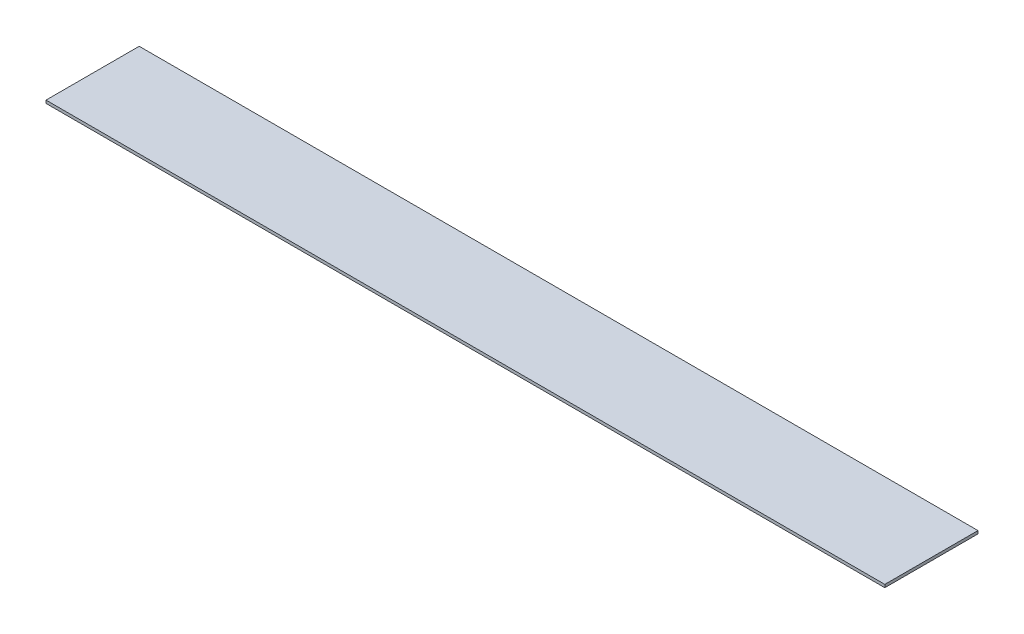
ISO-10303-21;
HEADER;
FILE_DESCRIPTION(('STEP AP214'),'2;1');
FILE_NAME('part.step','',(''),(''),'','','');
FILE_SCHEMA(('AUTOMOTIVE_DESIGN { 1 0 10303 214 1 1 1 1 }'));
ENDSEC;
DATA;
#1=APPLICATION_CONTEXT('core data for automotive mechanical design processes');
#2=APPLICATION_PROTOCOL_DEFINITION('international standard','automotive_design',2000,#1);
#3=PRODUCT_CONTEXT('',#1,'mechanical');
#4=PRODUCT('Part','Part','',(#3));
#5=PRODUCT_RELATED_PRODUCT_CATEGORY('part','',(#4));
#6=PRODUCT_DEFINITION_FORMATION('','',#4);
#7=PRODUCT_DEFINITION_CONTEXT('part definition',#1,'design');
#8=PRODUCT_DEFINITION('design','',#6,#7);
#9=PRODUCT_DEFINITION_SHAPE('','',#8);
#10=(LENGTH_UNIT() NAMED_UNIT(*) SI_UNIT(.MILLI.,.METRE.));
#11=(NAMED_UNIT(*) PLANE_ANGLE_UNIT() SI_UNIT($,.RADIAN.));
#12=(NAMED_UNIT(*) SI_UNIT($,.STERADIAN.) SOLID_ANGLE_UNIT());
#13=UNCERTAINTY_MEASURE_WITH_UNIT(LENGTH_MEASURE(1.E-05),#10,'distance_accuracy_value','');
#14=(GEOMETRIC_REPRESENTATION_CONTEXT(3) GLOBAL_UNCERTAINTY_ASSIGNED_CONTEXT((#13)) GLOBAL_UNIT_ASSIGNED_CONTEXT((#10,
#11,#12)) REPRESENTATION_CONTEXT('',''));
#15=CARTESIAN_POINT('',(0.,0.,0.));
#16=DIRECTION('',(0.,0.,1.));
#17=DIRECTION('',(1.,0.,0.));
#18=AXIS2_PLACEMENT_3D('',#15,#16,#17);
#19=CARTESIAN_POINT('',(0.,1.5875,16.1661320040576));
#20=DIRECTION('',(0.,0.,-1.));
#21=DIRECTION('',(-1.,0.,0.));
#22=AXIS2_PLACEMENT_3D('',#19,#20,#21);
#23=PLANE('',#22);
#24=DIRECTION('',(1.,0.,0.));
#25=VECTOR('',#24,1.);
#26=CARTESIAN_POINT('',(0.,0.,16.1661320040576));
#27=LINE('',#26,#25);
#28=CARTESIAN_POINT('',(-333.947872469119,0.,16.1661320040576));
#29=VERTEX_POINT('',#28);
#30=CARTESIAN_POINT('',(123.252127530881,0.,16.1661320040576));
#31=VERTEX_POINT('',#30);
#32=EDGE_CURVE('E103',#29,#31,#27,.T.);
#33=ORIENTED_EDGE('',*,*,#32,.T.);
#34=DIRECTION('',(0.,-1.,0.));
#35=VECTOR('',#34,1.);
#36=CARTESIAN_POINT('',(123.252127530881,1.5875,16.1661320040576));
#37=LINE('',#36,#35);
#38=CARTESIAN_POINT('',(123.252127530881,1.5875,16.1661320040576));
#39=VERTEX_POINT('',#38);
#40=EDGE_CURVE('E11',#39,#31,#37,.T.);
#41=ORIENTED_EDGE('',*,*,#40,.F.);
#42=DIRECTION('',(1.,0.,0.));
#43=VECTOR('',#42,1.);
#44=CARTESIAN_POINT('',(0.,1.5875,16.1661320040576));
#45=LINE('',#44,#43);
#46=CARTESIAN_POINT('',(-333.947872469119,1.5875,16.1661320040576));
#47=VERTEX_POINT('',#46);
#48=EDGE_CURVE('E89',#47,#39,#45,.T.);
#49=ORIENTED_EDGE('',*,*,#48,.F.);
#50=DIRECTION('',(0.,-1.,0.));
#51=VECTOR('',#50,1.);
#52=CARTESIAN_POINT('',(-333.947872469119,1.5875,16.1661320040576));
#53=LINE('',#52,#51);
#54=EDGE_CURVE('E56',#47,#29,#53,.T.);
#55=ORIENTED_EDGE('',*,*,#54,.T.);
#56=EDGE_LOOP('',(#33,#41,#49,#55));
#57=FACE_BOUND('',#56,.T.);
#58=ADVANCED_FACE('F40',(#57),#23,.F.);
#59=CARTESIAN_POINT('',(123.252127530881,1.5875,0.));
#60=DIRECTION('',(-1.,0.,0.));
#61=DIRECTION('',(0.,0.,1.));
#62=AXIS2_PLACEMENT_3D('',#59,#60,#61);
#63=PLANE('',#62);
#64=DIRECTION('',(0.,0.,-1.));
#65=VECTOR('',#64,1.);
#66=CARTESIAN_POINT('',(123.252127530881,0.,0.));
#67=LINE('',#66,#65);
#68=CARTESIAN_POINT('',(123.252127530881,0.,-34.6338679959424));
#69=VERTEX_POINT('',#68);
#70=EDGE_CURVE('E94',#31,#69,#67,.T.);
#71=ORIENTED_EDGE('',*,*,#70,.T.);
#72=DIRECTION('',(0.,-1.,0.));
#73=VECTOR('',#72,1.);
#74=CARTESIAN_POINT('',(123.252127530881,1.5875,-34.6338679959424));
#75=LINE('',#74,#73);
#76=CARTESIAN_POINT('',(123.252127530881,1.5875,-34.6338679959424));
#77=VERTEX_POINT('',#76);
#78=EDGE_CURVE('E48',#77,#69,#75,.T.);
#79=ORIENTED_EDGE('',*,*,#78,.F.);
#80=DIRECTION('',(0.,0.,-1.));
#81=VECTOR('',#80,1.);
#82=CARTESIAN_POINT('',(123.252127530881,1.5875,0.));
#83=LINE('',#82,#81);
#84=EDGE_CURVE('E81',#39,#77,#83,.T.);
#85=ORIENTED_EDGE('',*,*,#84,.F.);
#86=ORIENTED_EDGE('',*,*,#40,.T.);
#87=EDGE_LOOP('',(#71,#79,#85,#86));
#88=FACE_BOUND('',#87,.T.);
#89=ADVANCED_FACE('F93',(#88),#63,.F.);
#90=CARTESIAN_POINT('',(0.,1.5875,-34.6338679959424));
#91=DIRECTION('',(0.,0.,-1.));
#92=DIRECTION('',(-1.,0.,0.));
#93=AXIS2_PLACEMENT_3D('',#90,#91,#92);
#94=PLANE('',#93);
#95=DIRECTION('',(1.,0.,0.));
#96=VECTOR('',#95,1.);
#97=CARTESIAN_POINT('',(0.,0.,-34.6338679959424));
#98=LINE('',#97,#96);
#99=CARTESIAN_POINT('',(-333.947872469119,0.,-34.6338679959424));
#100=VERTEX_POINT('',#99);
#101=EDGE_CURVE('E106',#100,#69,#98,.T.);
#102=ORIENTED_EDGE('',*,*,#101,.F.);
#103=DIRECTION('',(0.,-1.,0.));
#104=VECTOR('',#103,1.);
#105=CARTESIAN_POINT('',(-333.947872469119,1.5875,-34.6338679959424));
#106=LINE('',#105,#104);
#107=CARTESIAN_POINT('',(-333.947872469119,1.5875,-34.6338679959424));
#108=VERTEX_POINT('',#107);
#109=EDGE_CURVE('E70',#108,#100,#106,.T.);
#110=ORIENTED_EDGE('',*,*,#109,.F.);
#111=DIRECTION('',(1.,0.,0.));
#112=VECTOR('',#111,1.);
#113=CARTESIAN_POINT('',(0.,1.5875,-34.6338679959424));
#114=LINE('',#113,#112);
#115=EDGE_CURVE('E88',#108,#77,#114,.T.);
#116=ORIENTED_EDGE('',*,*,#115,.T.);
#117=ORIENTED_EDGE('',*,*,#78,.T.);
#118=EDGE_LOOP('',(#102,#110,#116,#117));
#119=FACE_BOUND('',#118,.T.);
#120=ADVANCED_FACE('F97',(#119),#94,.T.);
#121=CARTESIAN_POINT('',(-333.947872469119,1.5875,0.));
#122=DIRECTION('',(-1.,0.,0.));
#123=DIRECTION('',(0.,0.,1.));
#124=AXIS2_PLACEMENT_3D('',#121,#122,#123);
#125=PLANE('',#124);
#126=DIRECTION('',(0.,0.,-1.));
#127=VECTOR('',#126,1.);
#128=CARTESIAN_POINT('',(-333.947872469119,0.,0.));
#129=LINE('',#128,#127);
#130=EDGE_CURVE('E108',#29,#100,#129,.T.);
#131=ORIENTED_EDGE('',*,*,#130,.F.);
#132=ORIENTED_EDGE('',*,*,#54,.F.);
#133=DIRECTION('',(0.,0.,-1.));
#134=VECTOR('',#133,1.);
#135=CARTESIAN_POINT('',(-333.947872469119,1.5875,0.));
#136=LINE('',#135,#134);
#137=EDGE_CURVE('E98',#47,#108,#136,.T.);
#138=ORIENTED_EDGE('',*,*,#137,.T.);
#139=ORIENTED_EDGE('',*,*,#109,.T.);
#140=EDGE_LOOP('',(#131,#132,#138,#139));
#141=FACE_BOUND('',#140,.T.);
#142=ADVANCED_FACE('F114',(#141),#125,.T.);
#143=CARTESIAN_POINT('',(0.,1.5875,0.));
#144=DIRECTION('',(0.,1.,0.));
#145=DIRECTION('',(0.,0.,1.));
#146=AXIS2_PLACEMENT_3D('',#143,#144,#145);
#147=PLANE('',#146);
#148=ORIENTED_EDGE('',*,*,#48,.T.);
#149=ORIENTED_EDGE('',*,*,#84,.T.);
#150=ORIENTED_EDGE('',*,*,#115,.F.);
#151=ORIENTED_EDGE('',*,*,#137,.F.);
#152=EDGE_LOOP('',(#148,#149,#150,#151));
#153=FACE_BOUND('',#152,.T.);
#154=ADVANCED_FACE('F85',(#153),#147,.T.);
#155=CARTESIAN_POINT('',(0.,0.,0.));
#156=DIRECTION('',(0.,1.,0.));
#157=DIRECTION('',(0.,0.,1.));
#158=AXIS2_PLACEMENT_3D('',#155,#156,#157);
#159=PLANE('',#158);
#160=ORIENTED_EDGE('',*,*,#32,.F.);
#161=ORIENTED_EDGE('',*,*,#130,.T.);
#162=ORIENTED_EDGE('',*,*,#101,.T.);
#163=ORIENTED_EDGE('',*,*,#70,.F.);
#164=EDGE_LOOP('',(#160,#161,#162,#163));
#165=FACE_BOUND('',#164,.T.);
#166=ADVANCED_FACE('F113',(#165),#159,.F.);
#167=CLOSED_SHELL('',(#58,#89,#120,#142,#154,#166));
#168=MANIFOLD_SOLID_BREP('B2',#167);
#169=ADVANCED_BREP_SHAPE_REPRESENTATION('',(#18,#168),#14);
#170=SHAPE_DEFINITION_REPRESENTATION(#9,#169);
ENDSEC;
END-ISO-10303-21;
